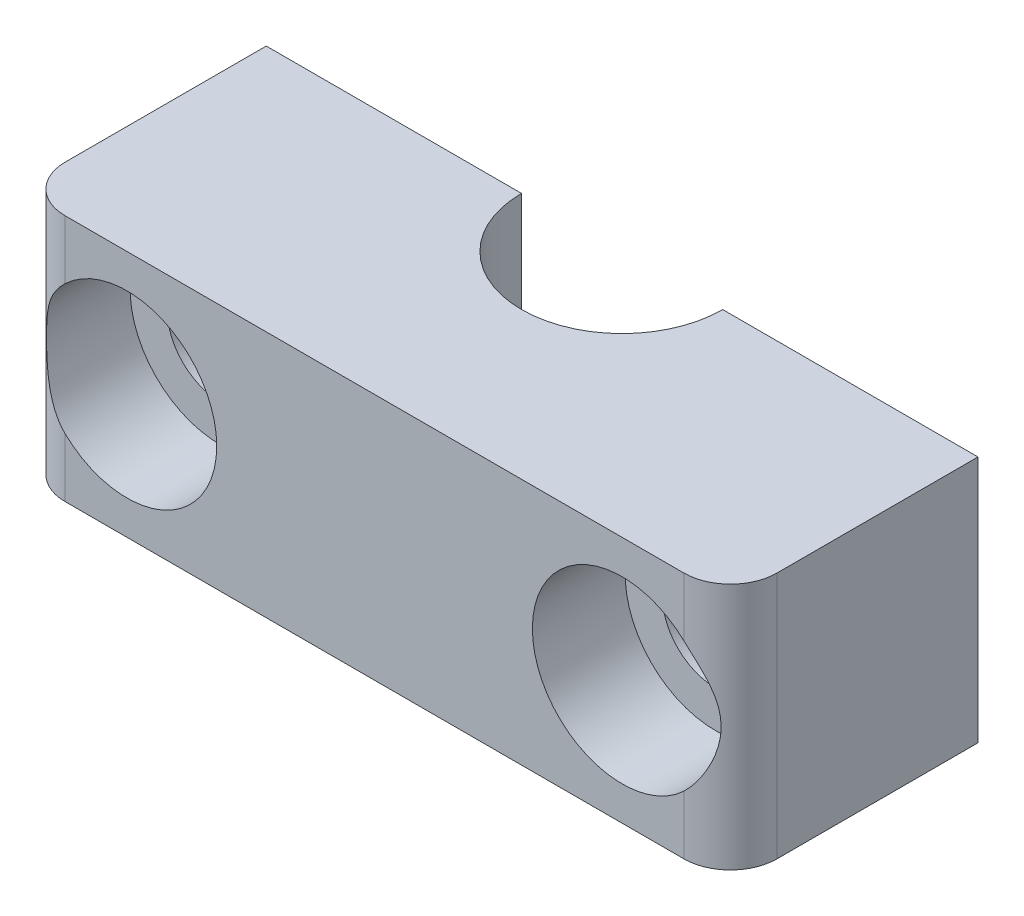
ISO-10303-21;
HEADER;
FILE_DESCRIPTION(('STEP AP214'),'2;1');
FILE_NAME('part.step','',(''),(''),'','','');
FILE_SCHEMA(('AUTOMOTIVE_DESIGN { 1 0 10303 214 1 1 1 1 }'));
ENDSEC;
DATA;
#1=APPLICATION_CONTEXT('core data for automotive mechanical design processes');
#2=APPLICATION_PROTOCOL_DEFINITION('international standard','automotive_design',2000,#1);
#3=PRODUCT_CONTEXT('',#1,'mechanical');
#4=PRODUCT('Part','Part','',(#3));
#5=PRODUCT_RELATED_PRODUCT_CATEGORY('part','',(#4));
#6=PRODUCT_DEFINITION_FORMATION('','',#4);
#7=PRODUCT_DEFINITION_CONTEXT('part definition',#1,'design');
#8=PRODUCT_DEFINITION('design','',#6,#7);
#9=PRODUCT_DEFINITION_SHAPE('','',#8);
#10=(LENGTH_UNIT() NAMED_UNIT(*) SI_UNIT(.MILLI.,.METRE.));
#11=(NAMED_UNIT(*) PLANE_ANGLE_UNIT() SI_UNIT($,.RADIAN.));
#12=(NAMED_UNIT(*) SI_UNIT($,.STERADIAN.) SOLID_ANGLE_UNIT());
#13=UNCERTAINTY_MEASURE_WITH_UNIT(LENGTH_MEASURE(1.E-05),#10,'distance_accuracy_value','');
#14=(GEOMETRIC_REPRESENTATION_CONTEXT(3) GLOBAL_UNCERTAINTY_ASSIGNED_CONTEXT((#13)) GLOBAL_UNIT_ASSIGNED_CONTEXT((#10,
#11,#12)) REPRESENTATION_CONTEXT('',''));
#15=CARTESIAN_POINT('',(0.,0.,0.));
#16=DIRECTION('',(0.,0.,1.));
#17=DIRECTION('',(1.,0.,0.));
#18=AXIS2_PLACEMENT_3D('',#15,#16,#17);
#19=CARTESIAN_POINT('',(0.,0.,0.));
#20=DIRECTION('',(0.,0.,1.));
#21=DIRECTION('',(1.,0.,0.));
#22=AXIS2_PLACEMENT_3D('',#19,#20,#21);
#23=PLANE('',#22);
#24=CARTESIAN_POINT('',(-8.,0.,0.));
#25=DIRECTION('',(0.,0.,1.));
#26=DIRECTION('',(1.,0.,0.));
#27=AXIS2_PLACEMENT_3D('',#24,#25,#26);
#28=CIRCLE('',#27,1.7);
#29=CARTESIAN_POINT('',(-6.3,0.,0.));
#30=VERTEX_POINT('',#29);
#31=EDGE_CURVE('E250',#30,#30,#28,.T.);
#32=ORIENTED_EDGE('',*,*,#31,.T.);
#33=EDGE_LOOP('',(#32));
#34=FACE_BOUND('',#33,.T.);
#35=DIRECTION('',(0.,-1.,0.));
#36=VECTOR('',#35,1.);
#37=CARTESIAN_POINT('',(-3.25,4.,0.));
#38=LINE('',#37,#36);
#39=CARTESIAN_POINT('',(-3.25,0.,0.));
#40=VERTEX_POINT('',#39);
#41=CARTESIAN_POINT('',(-3.25,4.,0.));
#42=VERTEX_POINT('',#41);
#43=EDGE_CURVE('E130',#40,#42,#38,.F.);
#44=ORIENTED_EDGE('',*,*,#43,.F.);
#45=DIRECTION('',(-1.,0.,0.));
#46=VECTOR('',#45,1.);
#47=CARTESIAN_POINT('',(0.,0.,0.));
#48=LINE('',#47,#46);
#49=CARTESIAN_POINT('',(-5.,0.,0.));
#50=VERTEX_POINT('',#49);
#51=EDGE_CURVE('E169',#40,#50,#48,.T.);
#52=ORIENTED_EDGE('',*,*,#51,.T.);
#53=DIRECTION('',(0.,1.,0.));
#54=VECTOR('',#53,1.);
#55=CARTESIAN_POINT('',(-5.,-4.,0.));
#56=LINE('',#55,#54);
#57=CARTESIAN_POINT('',(-5.,-4.,0.));
#58=VERTEX_POINT('',#57);
#59=EDGE_CURVE('E171',#50,#58,#56,.F.);
#60=ORIENTED_EDGE('',*,*,#59,.T.);
#61=DIRECTION('',(1.,0.,0.));
#62=VECTOR('',#61,1.);
#63=CARTESIAN_POINT('',(-11.5,-4.,0.));
#64=LINE('',#63,#62);
#65=CARTESIAN_POINT('',(-11.5,-4.,0.));
#66=VERTEX_POINT('',#65);
#67=EDGE_CURVE('E157',#66,#58,#64,.T.);
#68=ORIENTED_EDGE('',*,*,#67,.F.);
#69=DIRECTION('',(0.,-1.,0.));
#70=VECTOR('',#69,1.);
#71=CARTESIAN_POINT('',(-11.5,4.,0.));
#72=LINE('',#71,#70);
#73=CARTESIAN_POINT('',(-11.5,4.,0.));
#74=VERTEX_POINT('',#73);
#75=EDGE_CURVE('E147',#74,#66,#72,.T.);
#76=ORIENTED_EDGE('',*,*,#75,.F.);
#77=DIRECTION('',(-1.,0.,0.));
#78=VECTOR('',#77,1.);
#79=CARTESIAN_POINT('',(-11.5,4.,0.));
#80=LINE('',#79,#78);
#81=EDGE_CURVE('E148',#42,#74,#80,.T.);
#82=ORIENTED_EDGE('',*,*,#81,.F.);
#83=EDGE_LOOP('',(#44,#52,#60,#68,#76,#82));
#84=FACE_BOUND('',#83,.T.);
#85=ADVANCED_FACE('F34',(#34,#84),#23,.F.);
#86=CARTESIAN_POINT('',(8.,0.,0.));
#87=DIRECTION('',(0.,0.,1.));
#88=DIRECTION('',(1.,0.,0.));
#89=AXIS2_PLACEMENT_3D('',#86,#87,#88);
#90=CIRCLE('',#89,1.7);
#91=CARTESIAN_POINT('',(9.7,0.,0.));
#92=VERTEX_POINT('',#91);
#93=EDGE_CURVE('E262',#92,#92,#90,.T.);
#94=ORIENTED_EDGE('',*,*,#93,.T.);
#95=EDGE_LOOP('',(#94));
#96=FACE_BOUND('',#95,.T.);
#97=DIRECTION('',(0.,-1.,0.));
#98=VECTOR('',#97,1.);
#99=CARTESIAN_POINT('',(3.25,4.,0.));
#100=LINE('',#99,#98);
#101=CARTESIAN_POINT('',(3.25,4.,0.));
#102=VERTEX_POINT('',#101);
#103=CARTESIAN_POINT('',(3.25,0.,0.));
#104=VERTEX_POINT('',#103);
#105=EDGE_CURVE('E127',#102,#104,#100,.T.);
#106=ORIENTED_EDGE('',*,*,#105,.F.);
#107=CARTESIAN_POINT('',(11.5,4.,0.));
#108=VERTEX_POINT('',#107);
#109=EDGE_CURVE('E140',#108,#102,#80,.T.);
#110=ORIENTED_EDGE('',*,*,#109,.F.);
#111=DIRECTION('',(0.,1.,0.));
#112=VECTOR('',#111,1.);
#113=CARTESIAN_POINT('',(11.5,4.,0.));
#114=LINE('',#113,#112);
#115=CARTESIAN_POINT('',(11.5,-4.,0.));
#116=VERTEX_POINT('',#115);
#117=EDGE_CURVE('E153',#116,#108,#114,.T.);
#118=ORIENTED_EDGE('',*,*,#117,.F.);
#119=CARTESIAN_POINT('',(5.,-4.,0.));
#120=VERTEX_POINT('',#119);
#121=EDGE_CURVE('E151',#120,#116,#64,.T.);
#122=ORIENTED_EDGE('',*,*,#121,.F.);
#123=DIRECTION('',(0.,1.,0.));
#124=VECTOR('',#123,1.);
#125=CARTESIAN_POINT('',(5.,-4.,0.));
#126=LINE('',#125,#124);
#127=CARTESIAN_POINT('',(5.,0.,0.));
#128=VERTEX_POINT('',#127);
#129=EDGE_CURVE('E174',#120,#128,#126,.T.);
#130=ORIENTED_EDGE('',*,*,#129,.T.);
#131=EDGE_CURVE('E143',#128,#104,#48,.T.);
#132=ORIENTED_EDGE('',*,*,#131,.T.);
#133=EDGE_LOOP('',(#106,#110,#118,#122,#130,#132));
#134=FACE_BOUND('',#133,.T.);
#135=ADVANCED_FACE('F138',(#96,#134),#23,.F.);
#136=CARTESIAN_POINT('',(11.5,4.,8.));
#137=DIRECTION('',(-1.,0.,0.));
#138=DIRECTION('',(0.,-1.,0.));
#139=AXIS2_PLACEMENT_3D('',#136,#137,#138);
#140=PLANE('',#139);
#141=DIRECTION('',(0.,0.,-1.));
#142=VECTOR('',#141,1.);
#143=CARTESIAN_POINT('',(11.5,4.,8.));
#144=LINE('',#143,#142);
#145=CARTESIAN_POINT('',(11.5,4.,6.5));
#146=VERTEX_POINT('',#145);
#147=EDGE_CURVE('E146',#146,#108,#144,.T.);
#148=ORIENTED_EDGE('',*,*,#147,.F.);
#149=DIRECTION('',(0.,1.,0.));
#150=VECTOR('',#149,1.);
#151=CARTESIAN_POINT('',(11.5,-4.,6.5));
#152=LINE('',#151,#150);
#153=CARTESIAN_POINT('',(11.5,-4.,6.5));
#154=VERTEX_POINT('',#153);
#155=EDGE_CURVE('E11',#146,#154,#152,.F.);
#156=ORIENTED_EDGE('',*,*,#155,.T.);
#157=DIRECTION('',(0.,0.,-1.));
#158=VECTOR('',#157,1.);
#159=CARTESIAN_POINT('',(11.5,-4.,8.));
#160=LINE('',#159,#158);
#161=EDGE_CURVE('E161',#154,#116,#160,.T.);
#162=ORIENTED_EDGE('',*,*,#161,.T.);
#163=ORIENTED_EDGE('',*,*,#117,.T.);
#164=EDGE_LOOP('',(#148,#156,#162,#163));
#165=FACE_BOUND('',#164,.T.);
#166=ADVANCED_FACE('F295',(#165),#140,.F.);
#167=CARTESIAN_POINT('',(-11.5,4.,8.));
#168=DIRECTION('',(0.,-1.,0.));
#169=DIRECTION('',(0.,0.,-1.));
#170=AXIS2_PLACEMENT_3D('',#167,#168,#169);
#171=PLANE('',#170);
#172=DIRECTION('',(0.,0.,-1.));
#173=VECTOR('',#172,1.);
#174=CARTESIAN_POINT('',(-11.5,4.,8.));
#175=LINE('',#174,#173);
#176=CARTESIAN_POINT('',(-11.5,4.,6.5));
#177=VERTEX_POINT('',#176);
#178=EDGE_CURVE('E166',#177,#74,#175,.T.);
#179=ORIENTED_EDGE('',*,*,#178,.F.);
#180=CARTESIAN_POINT('',(-10.,4.,6.5));
#181=DIRECTION('',(0.,-1.,0.));
#182=DIRECTION('',(0.,0.,-1.));
#183=AXIS2_PLACEMENT_3D('',#180,#181,#182);
#184=CIRCLE('',#183,1.5);
#185=CARTESIAN_POINT('',(-10.,4.,8.));
#186=VERTEX_POINT('',#185);
#187=EDGE_CURVE('E224',#177,#186,#184,.F.);
#188=ORIENTED_EDGE('',*,*,#187,.T.);
#189=DIRECTION('',(-1.,0.,0.));
#190=VECTOR('',#189,1.);
#191=CARTESIAN_POINT('',(-11.5,4.,8.));
#192=LINE('',#191,#190);
#193=CARTESIAN_POINT('',(10.,4.,8.));
#194=VERTEX_POINT('',#193);
#195=EDGE_CURVE('E160',#194,#186,#192,.T.);
#196=ORIENTED_EDGE('',*,*,#195,.F.);
#197=CARTESIAN_POINT('',(10.,4.,6.5));
#198=DIRECTION('',(0.,-1.,0.));
#199=DIRECTION('',(0.,0.,-1.));
#200=AXIS2_PLACEMENT_3D('',#197,#198,#199);
#201=CIRCLE('',#200,1.5);
#202=EDGE_CURVE('E50',#194,#146,#201,.F.);
#203=ORIENTED_EDGE('',*,*,#202,.T.);
#204=ORIENTED_EDGE('',*,*,#147,.T.);
#205=ORIENTED_EDGE('',*,*,#109,.T.);
#206=CARTESIAN_POINT('',(0.,4.,0.));
#207=DIRECTION('',(0.,1.,0.));
#208=DIRECTION('',(0.,0.,1.));
#209=AXIS2_PLACEMENT_3D('',#206,#207,#208);
#210=CIRCLE('',#209,3.25);
#211=EDGE_CURVE('E124',#42,#102,#210,.T.);
#212=ORIENTED_EDGE('',*,*,#211,.F.);
#213=ORIENTED_EDGE('',*,*,#81,.T.);
#214=EDGE_LOOP('',(#179,#188,#196,#203,#204,#205,#212,#213));
#215=FACE_BOUND('',#214,.T.);
#216=ADVANCED_FACE('F145',(#215),#171,.F.);
#217=CARTESIAN_POINT('',(-11.5,4.,8.));
#218=DIRECTION('',(1.,0.,0.));
#219=DIRECTION('',(0.,1.,0.));
#220=AXIS2_PLACEMENT_3D('',#217,#218,#219);
#221=PLANE('',#220);
#222=DIRECTION('',(0.,0.,-1.));
#223=VECTOR('',#222,1.);
#224=CARTESIAN_POINT('',(-11.5,-4.,8.));
#225=LINE('',#224,#223);
#226=CARTESIAN_POINT('',(-11.5,-4.,6.5));
#227=VERTEX_POINT('',#226);
#228=EDGE_CURVE('E163',#227,#66,#225,.T.);
#229=ORIENTED_EDGE('',*,*,#228,.F.);
#230=DIRECTION('',(0.,-1.,0.));
#231=VECTOR('',#230,1.);
#232=CARTESIAN_POINT('',(-11.5,4.,6.5));
#233=LINE('',#232,#231);
#234=EDGE_CURVE('E58',#227,#177,#233,.F.);
#235=ORIENTED_EDGE('',*,*,#234,.T.);
#236=ORIENTED_EDGE('',*,*,#178,.T.);
#237=ORIENTED_EDGE('',*,*,#75,.T.);
#238=EDGE_LOOP('',(#229,#235,#236,#237));
#239=FACE_BOUND('',#238,.T.);
#240=ADVANCED_FACE('F288',(#239),#221,.F.);
#241=CARTESIAN_POINT('',(-11.5,-4.,8.));
#242=DIRECTION('',(0.,1.,0.));
#243=DIRECTION('',(0.,0.,1.));
#244=AXIS2_PLACEMENT_3D('',#241,#242,#243);
#245=PLANE('',#244);
#246=DIRECTION('',(1.,0.,0.));
#247=VECTOR('',#246,1.);
#248=CARTESIAN_POINT('',(-11.5,-4.,8.));
#249=LINE('',#248,#247);
#250=CARTESIAN_POINT('',(-10.,-4.,8.));
#251=VERTEX_POINT('',#250);
#252=CARTESIAN_POINT('',(10.,-4.,8.));
#253=VERTEX_POINT('',#252);
#254=EDGE_CURVE('E164',#251,#253,#249,.T.);
#255=ORIENTED_EDGE('',*,*,#254,.F.);
#256=CARTESIAN_POINT('',(-10.,-4.,6.5));
#257=DIRECTION('',(0.,1.,0.));
#258=DIRECTION('',(0.,0.,1.));
#259=AXIS2_PLACEMENT_3D('',#256,#257,#258);
#260=CIRCLE('',#259,1.5);
#261=EDGE_CURVE('E227',#251,#227,#260,.F.);
#262=ORIENTED_EDGE('',*,*,#261,.T.);
#263=ORIENTED_EDGE('',*,*,#228,.T.);
#264=ORIENTED_EDGE('',*,*,#67,.T.);
#265=CARTESIAN_POINT('',(0.,-4.,0.));
#266=DIRECTION('',(0.,1.,0.));
#267=DIRECTION('',(0.,0.,1.));
#268=AXIS2_PLACEMENT_3D('',#265,#266,#267);
#269=CIRCLE('',#268,5.);
#270=EDGE_CURVE('E266',#58,#120,#269,.T.);
#271=ORIENTED_EDGE('',*,*,#270,.T.);
#272=ORIENTED_EDGE('',*,*,#121,.T.);
#273=ORIENTED_EDGE('',*,*,#161,.F.);
#274=CARTESIAN_POINT('',(10.,-4.,6.5));
#275=DIRECTION('',(0.,1.,0.));
#276=DIRECTION('',(0.,0.,1.));
#277=AXIS2_PLACEMENT_3D('',#274,#275,#276);
#278=CIRCLE('',#277,1.5);
#279=EDGE_CURVE('E194',#154,#253,#278,.F.);
#280=ORIENTED_EDGE('',*,*,#279,.T.);
#281=EDGE_LOOP('',(#255,#262,#263,#264,#271,#272,#273,#280));
#282=FACE_BOUND('',#281,.T.);
#283=ADVANCED_FACE('F234',(#282),#245,.F.);
#284=CARTESIAN_POINT('',(0.,0.,8.));
#285=DIRECTION('',(0.,0.,1.));
#286=DIRECTION('',(1.,0.,0.));
#287=AXIS2_PLACEMENT_3D('',#284,#285,#286);
#288=PLANE('',#287);
#289=ORIENTED_EDGE('',*,*,#195,.T.);
#290=DIRECTION('',(0.,-1.,0.));
#291=VECTOR('',#290,1.);
#292=CARTESIAN_POINT('',(-10.,-4.,8.));
#293=LINE('',#292,#291);
#294=CARTESIAN_POINT('',(-10.,2.1,8.));
#295=VERTEX_POINT('',#294);
#296=EDGE_CURVE('E185',#186,#295,#293,.T.);
#297=ORIENTED_EDGE('',*,*,#296,.T.);
#298=CARTESIAN_POINT('',(-8.,0.,8.));
#299=DIRECTION('',(0.,0.,1.));
#300=DIRECTION('',(1.,0.,0.));
#301=AXIS2_PLACEMENT_3D('',#298,#299,#300);
#302=CIRCLE('',#301,2.9);
#303=CARTESIAN_POINT('',(-10.,-2.1,8.));
#304=VERTEX_POINT('',#303);
#305=EDGE_CURVE('E276',#304,#295,#302,.T.);
#306=ORIENTED_EDGE('',*,*,#305,.F.);
#307=DIRECTION('',(0.,-1.,0.));
#308=VECTOR('',#307,1.);
#309=CARTESIAN_POINT('',(-10.,-4.,8.));
#310=LINE('',#309,#308);
#311=EDGE_CURVE('E183',#304,#251,#310,.T.);
#312=ORIENTED_EDGE('',*,*,#311,.T.);
#313=ORIENTED_EDGE('',*,*,#254,.T.);
#314=DIRECTION('',(0.,1.,0.));
#315=VECTOR('',#314,1.);
#316=CARTESIAN_POINT('',(10.,4.,8.));
#317=LINE('',#316,#315);
#318=CARTESIAN_POINT('',(10.,-2.1,8.));
#319=VERTEX_POINT('',#318);
#320=EDGE_CURVE('E180',#253,#319,#317,.T.);
#321=ORIENTED_EDGE('',*,*,#320,.T.);
#322=CARTESIAN_POINT('',(8.,0.,8.));
#323=DIRECTION('',(0.,0.,1.));
#324=DIRECTION('',(1.,0.,0.));
#325=AXIS2_PLACEMENT_3D('',#322,#323,#324);
#326=CIRCLE('',#325,2.9);
#327=CARTESIAN_POINT('',(10.,2.1,8.));
#328=VERTEX_POINT('',#327);
#329=EDGE_CURVE('E248',#328,#319,#326,.T.);
#330=ORIENTED_EDGE('',*,*,#329,.F.);
#331=DIRECTION('',(0.,1.,0.));
#332=VECTOR('',#331,1.);
#333=CARTESIAN_POINT('',(10.,4.,8.));
#334=LINE('',#333,#332);
#335=EDGE_CURVE('E178',#328,#194,#334,.T.);
#336=ORIENTED_EDGE('',*,*,#335,.T.);
#337=EDGE_LOOP('',(#289,#297,#306,#312,#313,#321,#330,#336));
#338=FACE_BOUND('',#337,.T.);
#339=ADVANCED_FACE('F241',(#338),#288,.T.);
#340=CARTESIAN_POINT('',(0.,-4.,0.));
#341=DIRECTION('',(0.,1.,0.));
#342=DIRECTION('',(0.,0.,1.));
#343=AXIS2_PLACEMENT_3D('',#340,#341,#342);
#344=CYLINDRICAL_SURFACE('',#343,5.);
#345=ORIENTED_EDGE('',*,*,#270,.F.);
#346=ORIENTED_EDGE('',*,*,#59,.F.);
#347=CARTESIAN_POINT('',(0.,0.,0.));
#348=DIRECTION('',(0.,1.,0.));
#349=DIRECTION('',(0.,0.,1.));
#350=AXIS2_PLACEMENT_3D('',#347,#348,#349);
#351=CIRCLE('',#350,5.);
#352=EDGE_CURVE('E265',#50,#128,#351,.T.);
#353=ORIENTED_EDGE('',*,*,#352,.T.);
#354=ORIENTED_EDGE('',*,*,#129,.F.);
#355=EDGE_LOOP('',(#345,#346,#353,#354));
#356=FACE_BOUND('',#355,.T.);
#357=ADVANCED_FACE('F328',(#356),#344,.F.);
#358=CARTESIAN_POINT('',(0.,0.,0.));
#359=DIRECTION('',(0.,1.,0.));
#360=DIRECTION('',(0.,0.,1.));
#361=AXIS2_PLACEMENT_3D('',#358,#359,#360);
#362=PLANE('',#361);
#363=CARTESIAN_POINT('',(0.,0.,0.));
#364=DIRECTION('',(0.,1.,0.));
#365=DIRECTION('',(0.,0.,1.));
#366=AXIS2_PLACEMENT_3D('',#363,#364,#365);
#367=CIRCLE('',#366,3.25);
#368=EDGE_CURVE('E176',#104,#40,#367,.F.);
#369=ORIENTED_EDGE('',*,*,#368,.F.);
#370=ORIENTED_EDGE('',*,*,#131,.F.);
#371=ORIENTED_EDGE('',*,*,#352,.F.);
#372=ORIENTED_EDGE('',*,*,#51,.F.);
#373=EDGE_LOOP('',(#369,#370,#371,#372));
#374=FACE_BOUND('',#373,.T.);
#375=ADVANCED_FACE('F335',(#374),#362,.F.);
#376=CARTESIAN_POINT('',(8.,0.,8.));
#377=DIRECTION('',(0.,0.,1.));
#378=DIRECTION('',(1.,0.,0.));
#379=AXIS2_PLACEMENT_3D('',#376,#377,#378);
#380=CYLINDRICAL_SURFACE('',#379,1.7);
#381=ORIENTED_EDGE('',*,*,#93,.F.);
#382=EDGE_LOOP('',(#381));
#383=FACE_BOUND('',#382,.T.);
#384=CARTESIAN_POINT('',(8.,0.,5.));
#385=DIRECTION('',(0.,0.,1.));
#386=DIRECTION('',(1.,0.,0.));
#387=AXIS2_PLACEMENT_3D('',#384,#385,#386);
#388=CIRCLE('',#387,1.7);
#389=CARTESIAN_POINT('',(9.7,0.,5.));
#390=VERTEX_POINT('',#389);
#391=EDGE_CURVE('E253',#390,#390,#388,.T.);
#392=ORIENTED_EDGE('',*,*,#391,.T.);
#393=EDGE_LOOP('',(#392));
#394=FACE_BOUND('',#393,.T.);
#395=ADVANCED_FACE('F342',(#383,#394),#380,.F.);
#396=CARTESIAN_POINT('',(9.7,0.,5.));
#397=DIRECTION('',(0.,0.,-1.));
#398=DIRECTION('',(-1.,0.,0.));
#399=AXIS2_PLACEMENT_3D('',#396,#397,#398);
#400=PLANE('',#399);
#401=ORIENTED_EDGE('',*,*,#391,.F.);
#402=EDGE_LOOP('',(#401));
#403=FACE_BOUND('',#402,.T.);
#404=CARTESIAN_POINT('',(8.,0.,5.));
#405=DIRECTION('',(0.,0.,1.));
#406=DIRECTION('',(1.,0.,0.));
#407=AXIS2_PLACEMENT_3D('',#404,#405,#406);
#408=CIRCLE('',#407,2.9);
#409=CARTESIAN_POINT('',(10.9,0.,5.));
#410=VERTEX_POINT('',#409);
#411=EDGE_CURVE('E249',#410,#410,#408,.T.);
#412=ORIENTED_EDGE('',*,*,#411,.T.);
#413=EDGE_LOOP('',(#412));
#414=FACE_BOUND('',#413,.T.);
#415=ADVANCED_FACE('F217',(#403,#414),#400,.F.);
#416=CARTESIAN_POINT('',(8.,0.,8.));
#417=DIRECTION('',(0.,0.,1.));
#418=DIRECTION('',(1.,0.,0.));
#419=AXIS2_PLACEMENT_3D('',#416,#417,#418);
#420=CYLINDRICAL_SURFACE('',#419,2.9);
#421=ORIENTED_EDGE('',*,*,#411,.F.);
#422=EDGE_LOOP('',(#421));
#423=FACE_BOUND('',#422,.T.);
#424=ORIENTED_EDGE('',*,*,#329,.T.);
#425=CARTESIAN_POINT('',(10.,-2.1,8.));
#426=CARTESIAN_POINT('',(10.0462057476693,-2.05600232298577,7.99999391062727));
#427=CARTESIAN_POINT('',(10.0909041718376,-2.01051647886265,7.9978668491298));
#428=CARTESIAN_POINT('',(10.177014451185,-1.91693443239311,7.99014580279562));
#429=CARTESIAN_POINT('',(10.2184314069782,-1.86884248497148,7.98455732245723));
#430=CARTESIAN_POINT('',(10.3373628318803,-1.72124047999447,7.96378222450743));
#431=CARTESIAN_POINT('',(10.4097962690786,-1.61817612274886,7.9445780061185));
#432=CARTESIAN_POINT('',(10.5609222655605,-1.37073018068896,7.89411437043898));
#433=CARTESIAN_POINT('',(10.634376701163,-1.22357376681024,7.8609631351953));
#434=CARTESIAN_POINT('',(10.7556996794897,-0.918172373236458,7.79754917158957));
#435=CARTESIAN_POINT('',(10.8035554781707,-0.759921914732071,7.76728788810973));
#436=CARTESIAN_POINT('',(10.8515312852889,-0.532237858531213,7.73497462458008));
#437=CARTESIAN_POINT('',(10.8631128909909,-0.465972569946169,7.72685055424963));
#438=CARTESIAN_POINT('',(10.8816600381568,-0.332516001546782,7.71359355029452));
#439=CARTESIAN_POINT('',(10.8886279463734,-0.265325214584815,7.70845908321471));
#440=CARTESIAN_POINT('',(10.8978440417332,-0.130581273420328,7.70162760317345));
#441=CARTESIAN_POINT('',(10.90010171597,-0.0630291228921784,7.69992368084073));
#442=CARTESIAN_POINT('',(10.8998912451099,0.0720652404862311,7.70008159988652));
#443=CARTESIAN_POINT('',(10.8974229988843,0.139607453092902,7.70194351756944));
#444=CARTESIAN_POINT('',(10.8878101850482,0.274007145162028,7.70906093725708));
#445=CARTESIAN_POINT('',(10.8806771433662,0.340865900873695,7.71430807452152));
#446=CARTESIAN_POINT('',(10.8618455486439,0.473648148210783,7.72774324989998));
#447=CARTESIAN_POINT('',(10.8501450688487,0.539571232948275,7.73593252902805));
#448=CARTESIAN_POINT('',(10.808304208021,0.735746583429731,7.76403570197374));
#449=CARTESIAN_POINT('',(10.7714463753614,0.864107742346086,7.78746437512274));
#450=CARTESIAN_POINT('',(10.6764365346917,1.12605543621263,7.84001687796307));
#451=CARTESIAN_POINT('',(10.6165637495566,1.25893824425887,7.86947286269019));
#452=CARTESIAN_POINT('',(10.4772928427105,1.51462007260743,7.92399770133619));
#453=CARTESIAN_POINT('',(10.397964873949,1.63745325393418,7.94908177582728));
#454=CARTESIAN_POINT('',(10.2627635235008,1.81543890853828,7.97757073734031));
#455=CARTESIAN_POINT('',(10.2136532106329,1.8750201701458,7.98561341079554));
#456=CARTESIAN_POINT('',(10.110461450601,1.99047236409654,7.99682680851685));
#457=CARTESIAN_POINT('',(10.0563670014958,2.04633289739948,7.99998438475017));
#458=CARTESIAN_POINT('',(10.,2.1,8.));
#459=B_SPLINE_CURVE_WITH_KNOTS('',3,(#425,#426,#427,#428,#429,#430,#431,#432,#433,#434,#435,
#436,#437,#438,#439,#440,#441,#442,#443,#444,#445,#446,#447,#448,#449,#450,#451,#452,#453,#454,
#455,#456,#457,#458),.UNSPECIFIED.,.F.,.F.,(4,2,2,2,2,2,2,2,2,2,2,2,2,2,2,2,4),(0.,
0.191235692003773,0.38216805075573,0.763054345595287,1.26413762981556,1.7654701420627,
1.96856159967201,2.17154879374246,2.37412674593121,2.57670903307695,2.77879265492469,
2.98096161719466,3.38618567711934,3.83077486690653,4.27378390526172,4.50631565314512,
4.73947216829685),.UNSPECIFIED.);
#460=EDGE_CURVE('E43',#319,#328,#459,.T.);
#461=ORIENTED_EDGE('',*,*,#460,.T.);
#462=EDGE_LOOP('',(#424,#461));
#463=FACE_BOUND('',#462,.T.);
#464=ADVANCED_FACE('F212',(#423,#463),#420,.F.);
#465=CARTESIAN_POINT('',(-8.,0.,8.));
#466=DIRECTION('',(0.,0.,1.));
#467=DIRECTION('',(1.,0.,0.));
#468=AXIS2_PLACEMENT_3D('',#465,#466,#467);
#469=CYLINDRICAL_SURFACE('',#468,1.7);
#470=ORIENTED_EDGE('',*,*,#31,.F.);
#471=EDGE_LOOP('',(#470));
#472=FACE_BOUND('',#471,.T.);
#473=CARTESIAN_POINT('',(-8.,0.,5.));
#474=DIRECTION('',(0.,0.,1.));
#475=DIRECTION('',(1.,0.,0.));
#476=AXIS2_PLACEMENT_3D('',#473,#474,#475);
#477=CIRCLE('',#476,1.7);
#478=CARTESIAN_POINT('',(-6.3,0.,5.));
#479=VERTEX_POINT('',#478);
#480=EDGE_CURVE('E256',#479,#479,#477,.T.);
#481=ORIENTED_EDGE('',*,*,#480,.T.);
#482=EDGE_LOOP('',(#481));
#483=FACE_BOUND('',#482,.T.);
#484=ADVANCED_FACE('F208',(#472,#483),#469,.F.);
#485=CARTESIAN_POINT('',(-6.3,0.,5.));
#486=DIRECTION('',(0.,0.,-1.));
#487=DIRECTION('',(-1.,0.,0.));
#488=AXIS2_PLACEMENT_3D('',#485,#486,#487);
#489=PLANE('',#488);
#490=ORIENTED_EDGE('',*,*,#480,.F.);
#491=EDGE_LOOP('',(#490));
#492=FACE_BOUND('',#491,.T.);
#493=CARTESIAN_POINT('',(-8.,0.,5.));
#494=DIRECTION('',(0.,0.,1.));
#495=DIRECTION('',(1.,0.,0.));
#496=AXIS2_PLACEMENT_3D('',#493,#494,#495);
#497=CIRCLE('',#496,2.9);
#498=CARTESIAN_POINT('',(-5.1,0.,5.));
#499=VERTEX_POINT('',#498);
#500=EDGE_CURVE('E277',#499,#499,#497,.T.);
#501=ORIENTED_EDGE('',*,*,#500,.T.);
#502=EDGE_LOOP('',(#501));
#503=FACE_BOUND('',#502,.T.);
#504=ADVANCED_FACE('F204',(#492,#503),#489,.F.);
#505=CARTESIAN_POINT('',(-8.,0.,8.));
#506=DIRECTION('',(0.,0.,1.));
#507=DIRECTION('',(1.,0.,0.));
#508=AXIS2_PLACEMENT_3D('',#505,#506,#507);
#509=CYLINDRICAL_SURFACE('',#508,2.9);
#510=ORIENTED_EDGE('',*,*,#500,.F.);
#511=EDGE_LOOP('',(#510));
#512=FACE_BOUND('',#511,.T.);
#513=ORIENTED_EDGE('',*,*,#305,.T.);
#514=CARTESIAN_POINT('',(-10.,2.1,8.));
#515=CARTESIAN_POINT('',(-10.0462057476693,2.05600232298577,7.99999391062727));
#516=CARTESIAN_POINT('',(-10.0909041718376,2.01051647886266,7.9978668491298));
#517=CARTESIAN_POINT('',(-10.177014451185,1.91693443239311,7.99014580279562));
#518=CARTESIAN_POINT('',(-10.2184314069782,1.86884248497148,7.98455732245723));
#519=CARTESIAN_POINT('',(-10.3373628318803,1.72124047999448,7.96378222450743));
#520=CARTESIAN_POINT('',(-10.4097962690786,1.61817612274886,7.9445780061185));
#521=CARTESIAN_POINT('',(-10.5609222655605,1.37073018068896,7.89411437043898));
#522=CARTESIAN_POINT('',(-10.6343767011629,1.22357376681024,7.8609631351953));
#523=CARTESIAN_POINT('',(-10.7556996794897,0.91817237323646,7.79754917158957));
#524=CARTESIAN_POINT('',(-10.8035554781707,0.759921914732074,7.76728788810973));
#525=CARTESIAN_POINT('',(-10.8515312852889,0.532237858531216,7.73497462458008));
#526=CARTESIAN_POINT('',(-10.8631128909909,0.465972569946172,7.72685055424963));
#527=CARTESIAN_POINT('',(-10.8816600381568,0.332516001546785,7.71359355029452));
#528=CARTESIAN_POINT('',(-10.8886279463734,0.265325214584819,7.7084590832147));
#529=CARTESIAN_POINT('',(-10.8978440417332,0.130581273420332,7.70162760317345));
#530=CARTESIAN_POINT('',(-10.90010171597,0.063029122892183,7.69992368084072));
#531=CARTESIAN_POINT('',(-10.8998912451099,-0.0720652404862263,7.70008159988651));
#532=CARTESIAN_POINT('',(-10.8974229988843,-0.139607453092897,7.70194351756944));
#533=CARTESIAN_POINT('',(-10.8878101850482,-0.274007145162023,7.70906093725708));
#534=CARTESIAN_POINT('',(-10.8806771433662,-0.34086590087369,7.71430807452152));
#535=CARTESIAN_POINT('',(-10.8618455486439,-0.473648148210778,7.72774324989998));
#536=CARTESIAN_POINT('',(-10.8501450688487,-0.539571232948269,7.73593252902805));
#537=CARTESIAN_POINT('',(-10.808304208021,-0.735746583429725,7.76403570197374));
#538=CARTESIAN_POINT('',(-10.7714463753614,-0.86410774234608,7.78746437512274));
#539=CARTESIAN_POINT('',(-10.6764365346917,-1.12605543621262,7.84001687796307));
#540=CARTESIAN_POINT('',(-10.6165637495566,-1.25893824425886,7.86947286269019));
#541=CARTESIAN_POINT('',(-10.4772928427105,-1.51462007260743,7.92399770133619));
#542=CARTESIAN_POINT('',(-10.397964873949,-1.63745325393417,7.94908177582728));
#543=CARTESIAN_POINT('',(-10.2627635235008,-1.81543890853827,7.97757073734031));
#544=CARTESIAN_POINT('',(-10.2136532106329,-1.8750201701458,7.98561341079554));
#545=CARTESIAN_POINT('',(-10.110461450601,-1.99047236409654,7.99682680851684));
#546=CARTESIAN_POINT('',(-10.0563670014958,-2.04633289739949,7.99998438475017));
#547=CARTESIAN_POINT('',(-10.,-2.1,8.));
#548=B_SPLINE_CURVE_WITH_KNOTS('',3,(#514,#515,#516,#517,#518,#519,#520,#521,#522,#523,#524,
#525,#526,#527,#528,#529,#530,#531,#532,#533,#534,#535,#536,#537,#538,#539,#540,#541,#542,#543,
#544,#545,#546,#547),.UNSPECIFIED.,.F.,.F.,(4,2,2,2,2,2,2,2,2,2,2,2,2,2,2,2,4),(0.,
0.191235692003772,0.382168050755731,0.763054345595286,1.26413762981556,1.7654701420627,
1.96856159967201,2.17154879374246,2.37412674593121,2.57670903307695,2.77879265492469,
2.98096161719466,3.38618567711934,3.83077486690652,4.27378390526172,4.50631565314512,
4.73947216829686),.UNSPECIFIED.);
#549=EDGE_CURVE('E188',#295,#304,#548,.T.);
#550=ORIENTED_EDGE('',*,*,#549,.T.);
#551=EDGE_LOOP('',(#513,#550));
#552=FACE_BOUND('',#551,.T.);
#553=ADVANCED_FACE('F199',(#512,#552),#509,.F.);
#554=CARTESIAN_POINT('',(0.,4.,0.));
#555=DIRECTION('',(0.,-1.,0.));
#556=DIRECTION('',(0.,0.,-1.));
#557=AXIS2_PLACEMENT_3D('',#554,#555,#556);
#558=CYLINDRICAL_SURFACE('',#557,3.25);
#559=ORIENTED_EDGE('',*,*,#43,.T.);
#560=ORIENTED_EDGE('',*,*,#211,.T.);
#561=ORIENTED_EDGE('',*,*,#105,.T.);
#562=ORIENTED_EDGE('',*,*,#368,.T.);
#563=EDGE_LOOP('',(#559,#560,#561,#562));
#564=FACE_BOUND('',#563,.T.);
#565=ADVANCED_FACE('F126',(#564),#558,.F.);
#566=CARTESIAN_POINT('',(-10.,0.,6.5));
#567=DIRECTION('',(0.,1.,0.));
#568=DIRECTION('',(-1.,0.,0.));
#569=AXIS2_PLACEMENT_3D('',#566,#567,#568);
#570=CYLINDRICAL_SURFACE('',#569,1.5);
#571=ORIENTED_EDGE('',*,*,#187,.F.);
#572=ORIENTED_EDGE('',*,*,#234,.F.);
#573=ORIENTED_EDGE('',*,*,#261,.F.);
#574=ORIENTED_EDGE('',*,*,#311,.F.);
#575=ORIENTED_EDGE('',*,*,#549,.F.);
#576=ORIENTED_EDGE('',*,*,#296,.F.);
#577=EDGE_LOOP('',(#571,#572,#573,#574,#575,#576));
#578=FACE_BOUND('',#577,.T.);
#579=ADVANCED_FACE('F196',(#578),#570,.T.);
#580=CARTESIAN_POINT('',(10.,0.,6.5));
#581=DIRECTION('',(0.,-1.,0.));
#582=DIRECTION('',(1.,0.,0.));
#583=AXIS2_PLACEMENT_3D('',#580,#581,#582);
#584=CYLINDRICAL_SURFACE('',#583,1.5);
#585=ORIENTED_EDGE('',*,*,#279,.F.);
#586=ORIENTED_EDGE('',*,*,#155,.F.);
#587=ORIENTED_EDGE('',*,*,#202,.F.);
#588=ORIENTED_EDGE('',*,*,#335,.F.);
#589=ORIENTED_EDGE('',*,*,#460,.F.);
#590=ORIENTED_EDGE('',*,*,#320,.F.);
#591=EDGE_LOOP('',(#585,#586,#587,#588,#589,#590));
#592=FACE_BOUND('',#591,.T.);
#593=ADVANCED_FACE('F36',(#592),#584,.T.);
#594=CLOSED_SHELL('',(#85,#135,#166,#216,#240,#283,#339,#357,#375,#395,#415,#464,#484,#504,#553,
#565,#579,#593));
#595=MANIFOLD_SOLID_BREP('B2',#594);
#596=ADVANCED_BREP_SHAPE_REPRESENTATION('',(#18,#595),#14);
#597=SHAPE_DEFINITION_REPRESENTATION(#9,#596);
ENDSEC;
END-ISO-10303-21;
